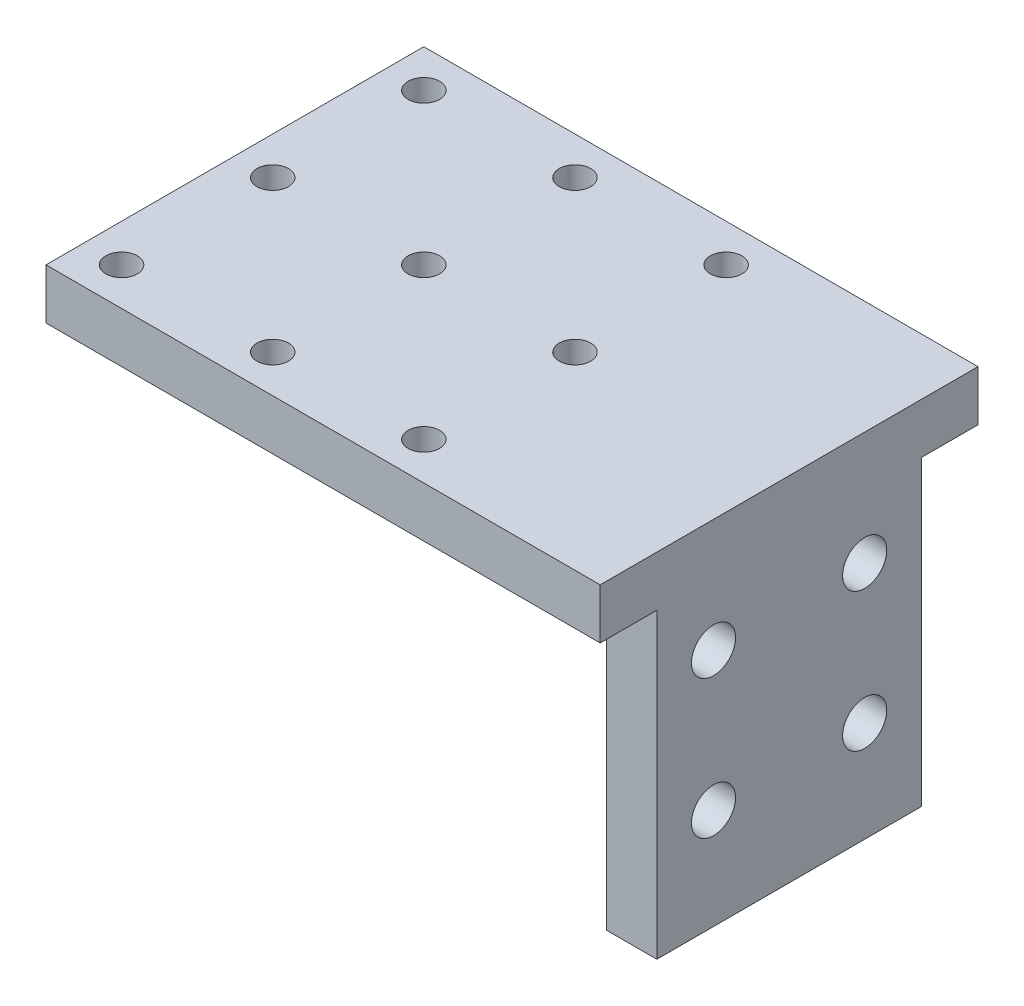
ISO-10303-21;
HEADER;
FILE_DESCRIPTION(('STEP AP214'),'2;1');
FILE_NAME('part.step','',(''),(''),'','','');
FILE_SCHEMA(('AUTOMOTIVE_DESIGN { 1 0 10303 214 1 1 1 1 }'));
ENDSEC;
DATA;
#1=APPLICATION_CONTEXT('core data for automotive mechanical design processes');
#2=APPLICATION_PROTOCOL_DEFINITION('international standard','automotive_design',2000,#1);
#3=PRODUCT_CONTEXT('',#1,'mechanical');
#4=PRODUCT('Part','Part','',(#3));
#5=PRODUCT_RELATED_PRODUCT_CATEGORY('part','',(#4));
#6=PRODUCT_DEFINITION_FORMATION('','',#4);
#7=PRODUCT_DEFINITION_CONTEXT('part definition',#1,'design');
#8=PRODUCT_DEFINITION('design','',#6,#7);
#9=PRODUCT_DEFINITION_SHAPE('','',#8);
#10=(LENGTH_UNIT() NAMED_UNIT(*) SI_UNIT(.MILLI.,.METRE.));
#11=(NAMED_UNIT(*) PLANE_ANGLE_UNIT() SI_UNIT($,.RADIAN.));
#12=(NAMED_UNIT(*) SI_UNIT($,.STERADIAN.) SOLID_ANGLE_UNIT());
#13=UNCERTAINTY_MEASURE_WITH_UNIT(LENGTH_MEASURE(1.E-05),#10,'distance_accuracy_value','');
#14=(GEOMETRIC_REPRESENTATION_CONTEXT(3) GLOBAL_UNCERTAINTY_ASSIGNED_CONTEXT((#13)) GLOBAL_UNIT_ASSIGNED_CONTEXT((#10,
#11,#12)) REPRESENTATION_CONTEXT('',''));
#15=CARTESIAN_POINT('',(0.,0.,0.));
#16=DIRECTION('',(0.,0.,1.));
#17=DIRECTION('',(1.,0.,0.));
#18=AXIS2_PLACEMENT_3D('',#15,#16,#17);
#19=CARTESIAN_POINT('',(0.,0.,-30.));
#20=DIRECTION('',(-1.,0.,0.));
#21=DIRECTION('',(0.,0.,1.));
#22=AXIS2_PLACEMENT_3D('',#19,#20,#21);
#23=PLANE('',#22);
#24=CARTESIAN_POINT('',(0.,19.,-9.));
#25=DIRECTION('',(-1.,0.,0.));
#26=DIRECTION('',(0.,0.,1.));
#27=AXIS2_PLACEMENT_3D('',#24,#25,#26);
#28=CIRCLE('',#27,1.75);
#29=CARTESIAN_POINT('',(0.,19.,-7.25));
#30=VERTEX_POINT('',#29);
#31=EDGE_CURVE('E165',#30,#30,#28,.T.);
#32=ORIENTED_EDGE('',*,*,#31,.F.);
#33=EDGE_LOOP('',(#32));
#34=FACE_BOUND('',#33,.T.);
#35=CARTESIAN_POINT('',(0.,8.,-9.));
#36=DIRECTION('',(-1.,0.,0.));
#37=DIRECTION('',(0.,0.,1.));
#38=AXIS2_PLACEMENT_3D('',#35,#36,#37);
#39=CIRCLE('',#38,1.75);
#40=CARTESIAN_POINT('',(0.,8.,-7.25));
#41=VERTEX_POINT('',#40);
#42=EDGE_CURVE('E40',#41,#41,#39,.T.);
#43=ORIENTED_EDGE('',*,*,#42,.F.);
#44=EDGE_LOOP('',(#43));
#45=FACE_BOUND('',#44,.T.);
#46=DIRECTION('',(0.,0.,1.));
#47=VECTOR('',#46,1.);
#48=CARTESIAN_POINT('',(0.,24.,-30.));
#49=LINE('',#48,#47);
#50=CARTESIAN_POINT('',(0.,24.,-13.));
#51=VERTEX_POINT('',#50);
#52=CARTESIAN_POINT('',(0.,24.,-4.5));
#53=VERTEX_POINT('',#52);
#54=EDGE_CURVE('E143',#51,#53,#49,.T.);
#55=ORIENTED_EDGE('',*,*,#54,.F.);
#56=DIRECTION('',(0.,1.,0.));
#57=VECTOR('',#56,1.);
#58=CARTESIAN_POINT('',(0.,0.,-13.));
#59=LINE('',#58,#57);
#60=CARTESIAN_POINT('',(0.,0.,-13.));
#61=VERTEX_POINT('',#60);
#62=EDGE_CURVE('E53',#61,#51,#59,.T.);
#63=ORIENTED_EDGE('',*,*,#62,.F.);
#64=DIRECTION('',(0.,0.,1.));
#65=VECTOR('',#64,1.);
#66=CARTESIAN_POINT('',(0.,0.,-30.));
#67=LINE('',#66,#65);
#68=CARTESIAN_POINT('',(0.,0.,-4.5));
#69=VERTEX_POINT('',#68);
#70=EDGE_CURVE('E45',#61,#69,#67,.T.);
#71=ORIENTED_EDGE('',*,*,#70,.T.);
#72=DIRECTION('',(0.,-1.,0.));
#73=VECTOR('',#72,1.);
#74=CARTESIAN_POINT('',(0.,0.,-4.5));
#75=LINE('',#74,#73);
#76=EDGE_CURVE('E202',#53,#69,#75,.T.);
#77=ORIENTED_EDGE('',*,*,#76,.F.);
#78=EDGE_LOOP('',(#55,#63,#71,#77));
#79=FACE_BOUND('',#78,.T.);
#80=ADVANCED_FACE('F36',(#34,#45,#79),#23,.T.);
#81=CARTESIAN_POINT('',(4.,28.,-30.));
#82=DIRECTION('',(1.,0.,0.));
#83=DIRECTION('',(0.,1.,0.));
#84=AXIS2_PLACEMENT_3D('',#81,#82,#83);
#85=PLANE('',#84);
#86=CARTESIAN_POINT('',(4.,8.,-9.));
#87=DIRECTION('',(1.,0.,0.));
#88=DIRECTION('',(0.,1.,0.));
#89=AXIS2_PLACEMENT_3D('',#86,#87,#88);
#90=CIRCLE('',#89,1.75);
#91=CARTESIAN_POINT('',(4.,9.75,-9.));
#92=VERTEX_POINT('',#91);
#93=EDGE_CURVE('E185',#92,#92,#90,.T.);
#94=ORIENTED_EDGE('',*,*,#93,.F.);
#95=EDGE_LOOP('',(#94));
#96=FACE_BOUND('',#95,.T.);
#97=CARTESIAN_POINT('',(4.,8.,-21.));
#98=DIRECTION('',(1.,0.,0.));
#99=DIRECTION('',(0.,1.,0.));
#100=AXIS2_PLACEMENT_3D('',#97,#98,#99);
#101=CIRCLE('',#100,1.75);
#102=CARTESIAN_POINT('',(4.,9.75,-21.));
#103=VERTEX_POINT('',#102);
#104=EDGE_CURVE('E175',#103,#103,#101,.T.);
#105=ORIENTED_EDGE('',*,*,#104,.F.);
#106=EDGE_LOOP('',(#105));
#107=FACE_BOUND('',#106,.T.);
#108=CARTESIAN_POINT('',(4.,19.,-21.));
#109=DIRECTION('',(1.,0.,0.));
#110=DIRECTION('',(0.,1.,0.));
#111=AXIS2_PLACEMENT_3D('',#108,#109,#110);
#112=CIRCLE('',#111,1.75);
#113=CARTESIAN_POINT('',(4.,20.75,-21.));
#114=VERTEX_POINT('',#113);
#115=EDGE_CURVE('E172',#114,#114,#112,.T.);
#116=ORIENTED_EDGE('',*,*,#115,.F.);
#117=EDGE_LOOP('',(#116));
#118=FACE_BOUND('',#117,.T.);
#119=CARTESIAN_POINT('',(4.,19.,-9.));
#120=DIRECTION('',(1.,0.,0.));
#121=DIRECTION('',(0.,1.,0.));
#122=AXIS2_PLACEMENT_3D('',#119,#120,#121);
#123=CIRCLE('',#122,1.75);
#124=CARTESIAN_POINT('',(4.,20.75,-9.));
#125=VERTEX_POINT('',#124);
#126=EDGE_CURVE('E169',#125,#125,#123,.T.);
#127=ORIENTED_EDGE('',*,*,#126,.F.);
#128=EDGE_LOOP('',(#127));
#129=FACE_BOUND('',#128,.T.);
#130=DIRECTION('',(0.,1.,0.));
#131=VECTOR('',#130,1.);
#132=CARTESIAN_POINT('',(4.,0.,-25.5));
#133=LINE('',#132,#131);
#134=CARTESIAN_POINT('',(4.,0.,-25.5));
#135=VERTEX_POINT('',#134);
#136=CARTESIAN_POINT('',(4.,24.,-25.5));
#137=VERTEX_POINT('',#136);
#138=EDGE_CURVE('E194',#135,#137,#133,.T.);
#139=ORIENTED_EDGE('',*,*,#138,.T.);
#140=DIRECTION('',(0.,0.,-1.));
#141=VECTOR('',#140,1.);
#142=CARTESIAN_POINT('',(4.,24.,-25.5));
#143=LINE('',#142,#141);
#144=CARTESIAN_POINT('',(4.,24.,-30.));
#145=VERTEX_POINT('',#144);
#146=EDGE_CURVE('E199',#137,#145,#143,.T.);
#147=ORIENTED_EDGE('',*,*,#146,.T.);
#148=DIRECTION('',(0.,1.,0.));
#149=VECTOR('',#148,1.);
#150=CARTESIAN_POINT('',(4.,28.,-30.));
#151=LINE('',#150,#149);
#152=CARTESIAN_POINT('',(4.,28.,-30.));
#153=VERTEX_POINT('',#152);
#154=EDGE_CURVE('E267',#145,#153,#151,.T.);
#155=ORIENTED_EDGE('',*,*,#154,.T.);
#156=DIRECTION('',(0.,0.,1.));
#157=VECTOR('',#156,1.);
#158=CARTESIAN_POINT('',(4.,28.,-30.));
#159=LINE('',#158,#157);
#160=CARTESIAN_POINT('',(4.,28.,0.));
#161=VERTEX_POINT('',#160);
#162=EDGE_CURVE('E159',#153,#161,#159,.T.);
#163=ORIENTED_EDGE('',*,*,#162,.T.);
#164=DIRECTION('',(0.,1.,0.));
#165=VECTOR('',#164,1.);
#166=CARTESIAN_POINT('',(4.,28.,0.));
#167=LINE('',#166,#165);
#168=CARTESIAN_POINT('',(4.,24.,0.));
#169=VERTEX_POINT('',#168);
#170=EDGE_CURVE('E266',#169,#161,#167,.T.);
#171=ORIENTED_EDGE('',*,*,#170,.F.);
#172=DIRECTION('',(0.,0.,1.));
#173=VECTOR('',#172,1.);
#174=CARTESIAN_POINT('',(4.,24.,-4.5));
#175=LINE('',#174,#173);
#176=CARTESIAN_POINT('',(4.,24.,-4.5));
#177=VERTEX_POINT('',#176);
#178=EDGE_CURVE('E210',#177,#169,#175,.T.);
#179=ORIENTED_EDGE('',*,*,#178,.F.);
#180=DIRECTION('',(0.,1.,0.));
#181=VECTOR('',#180,1.);
#182=CARTESIAN_POINT('',(4.,0.,-4.5));
#183=LINE('',#182,#181);
#184=CARTESIAN_POINT('',(4.,0.,-4.5));
#185=VERTEX_POINT('',#184);
#186=EDGE_CURVE('E205',#185,#177,#183,.T.);
#187=ORIENTED_EDGE('',*,*,#186,.F.);
#188=DIRECTION('',(0.,0.,1.));
#189=VECTOR('',#188,1.);
#190=CARTESIAN_POINT('',(4.,0.,-30.));
#191=LINE('',#190,#189);
#192=EDGE_CURVE('E162',#135,#185,#191,.T.);
#193=ORIENTED_EDGE('',*,*,#192,.F.);
#194=EDGE_LOOP('',(#139,#147,#155,#163,#171,#179,#187,#193));
#195=FACE_BOUND('',#194,.T.);
#196=ADVANCED_FACE('F296',(#96,#107,#118,#129,#195),#85,.T.);
#197=CARTESIAN_POINT('',(0.,0.,-30.));
#198=DIRECTION('',(0.,0.,-1.));
#199=DIRECTION('',(-1.,0.,0.));
#200=AXIS2_PLACEMENT_3D('',#197,#198,#199);
#201=PLANE('',#200);
#202=ORIENTED_EDGE('',*,*,#154,.F.);
#203=DIRECTION('',(1.,0.,0.));
#204=VECTOR('',#203,1.);
#205=CARTESIAN_POINT('',(0.,24.,-30.));
#206=LINE('',#205,#204);
#207=CARTESIAN_POINT('',(-40.,24.,-30.));
#208=VERTEX_POINT('',#207);
#209=EDGE_CURVE('E164',#208,#145,#206,.T.);
#210=ORIENTED_EDGE('',*,*,#209,.F.);
#211=DIRECTION('',(0.,-1.,0.));
#212=VECTOR('',#211,1.);
#213=CARTESIAN_POINT('',(-40.,24.,-30.));
#214=LINE('',#213,#212);
#215=CARTESIAN_POINT('',(-40.,28.,-30.));
#216=VERTEX_POINT('',#215);
#217=EDGE_CURVE('E272',#216,#208,#214,.T.);
#218=ORIENTED_EDGE('',*,*,#217,.F.);
#219=DIRECTION('',(-1.,0.,0.));
#220=VECTOR('',#219,1.);
#221=CARTESIAN_POINT('',(-40.,28.,-30.));
#222=LINE('',#221,#220);
#223=EDGE_CURVE('E269',#153,#216,#222,.T.);
#224=ORIENTED_EDGE('',*,*,#223,.F.);
#225=EDGE_LOOP('',(#202,#210,#218,#224));
#226=FACE_BOUND('',#225,.T.);
#227=ADVANCED_FACE('F303',(#226),#201,.T.);
#228=CARTESIAN_POINT('',(4.,0.,-30.));
#229=DIRECTION('',(0.,-1.,0.));
#230=DIRECTION('',(1.,0.,0.));
#231=AXIS2_PLACEMENT_3D('',#228,#229,#230);
#232=PLANE('',#231);
#233=DIRECTION('',(1.,0.,0.));
#234=VECTOR('',#233,1.);
#235=CARTESIAN_POINT('',(0.,0.,-25.5));
#236=LINE('',#235,#234);
#237=CARTESIAN_POINT('',(0.,0.,-25.5));
#238=VERTEX_POINT('',#237);
#239=EDGE_CURVE('E197',#238,#135,#236,.T.);
#240=ORIENTED_EDGE('',*,*,#239,.T.);
#241=ORIENTED_EDGE('',*,*,#192,.T.);
#242=DIRECTION('',(1.,0.,0.));
#243=VECTOR('',#242,1.);
#244=CARTESIAN_POINT('',(0.,0.,-4.5));
#245=LINE('',#244,#243);
#246=EDGE_CURVE('E148',#69,#185,#245,.T.);
#247=ORIENTED_EDGE('',*,*,#246,.F.);
#248=ORIENTED_EDGE('',*,*,#70,.F.);
#249=DIRECTION('',(0.,0.,1.));
#250=VECTOR('',#249,1.);
#251=CARTESIAN_POINT('',(0.,0.,-17.));
#252=LINE('',#251,#250);
#253=CARTESIAN_POINT('',(0.,0.,-17.));
#254=VERTEX_POINT('',#253);
#255=EDGE_CURVE('E124',#254,#61,#252,.T.);
#256=ORIENTED_EDGE('',*,*,#255,.F.);
#257=EDGE_CURVE('E11',#238,#254,#67,.T.);
#258=ORIENTED_EDGE('',*,*,#257,.F.);
#259=EDGE_LOOP('',(#240,#241,#247,#248,#256,#258));
#260=FACE_BOUND('',#259,.T.);
#261=ADVANCED_FACE('F38',(#260),#232,.T.);
#262=DIRECTION('',(0.,1.,0.));
#263=VECTOR('',#262,1.);
#264=CARTESIAN_POINT('',(0.,0.,-17.));
#265=LINE('',#264,#263);
#266=CARTESIAN_POINT('',(0.,24.,-17.));
#267=VERTEX_POINT('',#266);
#268=EDGE_CURVE('E314',#254,#267,#265,.T.);
#269=ORIENTED_EDGE('',*,*,#268,.T.);
#270=CARTESIAN_POINT('',(0.,24.,-25.5));
#271=VERTEX_POINT('',#270);
#272=EDGE_CURVE('E149',#271,#267,#49,.T.);
#273=ORIENTED_EDGE('',*,*,#272,.F.);
#274=DIRECTION('',(0.,-1.,0.));
#275=VECTOR('',#274,1.);
#276=CARTESIAN_POINT('',(0.,0.,-25.5));
#277=LINE('',#276,#275);
#278=EDGE_CURVE('E168',#271,#238,#277,.T.);
#279=ORIENTED_EDGE('',*,*,#278,.T.);
#280=ORIENTED_EDGE('',*,*,#257,.T.);
#281=EDGE_LOOP('',(#269,#273,#279,#280));
#282=FACE_BOUND('',#281,.T.);
#283=CARTESIAN_POINT('',(0.,8.,-21.));
#284=DIRECTION('',(-1.,0.,0.));
#285=DIRECTION('',(0.,0.,1.));
#286=AXIS2_PLACEMENT_3D('',#283,#284,#285);
#287=CIRCLE('',#286,1.75);
#288=CARTESIAN_POINT('',(0.,8.,-19.25));
#289=VERTEX_POINT('',#288);
#290=EDGE_CURVE('E173',#289,#289,#287,.T.);
#291=ORIENTED_EDGE('',*,*,#290,.F.);
#292=EDGE_LOOP('',(#291));
#293=FACE_BOUND('',#292,.T.);
#294=CARTESIAN_POINT('',(0.,19.,-21.));
#295=DIRECTION('',(-1.,0.,0.));
#296=DIRECTION('',(0.,0.,1.));
#297=AXIS2_PLACEMENT_3D('',#294,#295,#296);
#298=CIRCLE('',#297,1.75);
#299=CARTESIAN_POINT('',(0.,19.,-19.25));
#300=VERTEX_POINT('',#299);
#301=EDGE_CURVE('E170',#300,#300,#298,.T.);
#302=ORIENTED_EDGE('',*,*,#301,.F.);
#303=EDGE_LOOP('',(#302));
#304=FACE_BOUND('',#303,.T.);
#305=ADVANCED_FACE('F311',(#282,#293,#304),#23,.T.);
#306=CARTESIAN_POINT('',(0.,24.,-30.));
#307=DIRECTION('',(0.,-1.,0.));
#308=DIRECTION('',(1.,0.,0.));
#309=AXIS2_PLACEMENT_3D('',#306,#307,#308);
#310=PLANE('',#309);
#311=DIRECTION('',(-1.,0.,0.));
#312=VECTOR('',#311,1.);
#313=CARTESIAN_POINT('',(0.,24.,-17.));
#314=LINE('',#313,#312);
#315=CARTESIAN_POINT('',(-8.,24.,-17.));
#316=VERTEX_POINT('',#315);
#317=EDGE_CURVE('E134',#267,#316,#314,.T.);
#318=ORIENTED_EDGE('',*,*,#317,.T.);
#319=DIRECTION('',(0.,0.,1.));
#320=VECTOR('',#319,1.);
#321=CARTESIAN_POINT('',(-8.,24.,-17.));
#322=LINE('',#321,#320);
#323=CARTESIAN_POINT('',(-8.,24.,-13.));
#324=VERTEX_POINT('',#323);
#325=EDGE_CURVE('E133',#316,#324,#322,.T.);
#326=ORIENTED_EDGE('',*,*,#325,.T.);
#327=DIRECTION('',(-1.,0.,0.));
#328=VECTOR('',#327,1.);
#329=CARTESIAN_POINT('',(0.,24.,-13.));
#330=LINE('',#329,#328);
#331=EDGE_CURVE('E137',#51,#324,#330,.T.);
#332=ORIENTED_EDGE('',*,*,#331,.F.);
#333=ORIENTED_EDGE('',*,*,#54,.T.);
#334=DIRECTION('',(-1.,0.,0.));
#335=VECTOR('',#334,1.);
#336=CARTESIAN_POINT('',(0.,24.,-4.5));
#337=LINE('',#336,#335);
#338=EDGE_CURVE('E207',#177,#53,#337,.T.);
#339=ORIENTED_EDGE('',*,*,#338,.F.);
#340=ORIENTED_EDGE('',*,*,#178,.T.);
#341=DIRECTION('',(1.,0.,0.));
#342=VECTOR('',#341,1.);
#343=CARTESIAN_POINT('',(0.,24.,0.));
#344=LINE('',#343,#342);
#345=CARTESIAN_POINT('',(-40.,24.,0.));
#346=VERTEX_POINT('',#345);
#347=EDGE_CURVE('E61',#346,#169,#344,.T.);
#348=ORIENTED_EDGE('',*,*,#347,.F.);
#349=DIRECTION('',(0.,0.,1.));
#350=VECTOR('',#349,1.);
#351=CARTESIAN_POINT('',(-40.,24.,-30.));
#352=LINE('',#351,#350);
#353=EDGE_CURVE('E155',#208,#346,#352,.T.);
#354=ORIENTED_EDGE('',*,*,#353,.F.);
#355=ORIENTED_EDGE('',*,*,#209,.T.);
#356=ORIENTED_EDGE('',*,*,#146,.F.);
#357=DIRECTION('',(-1.,0.,0.));
#358=VECTOR('',#357,1.);
#359=CARTESIAN_POINT('',(0.,24.,-25.5));
#360=LINE('',#359,#358);
#361=EDGE_CURVE('E192',#137,#271,#360,.T.);
#362=ORIENTED_EDGE('',*,*,#361,.T.);
#363=ORIENTED_EDGE('',*,*,#272,.T.);
#364=EDGE_LOOP('',(#318,#326,#332,#333,#339,#340,#348,#354,#355,#356,#362,#363));
#365=FACE_BOUND('',#364,.T.);
#366=CARTESIAN_POINT('',(-25.,24.,-15.));
#367=DIRECTION('',(0.,-1.,0.));
#368=DIRECTION('',(1.,0.,0.));
#369=AXIS2_PLACEMENT_3D('',#366,#367,#368);
#370=CIRCLE('',#369,1.25);
#371=CARTESIAN_POINT('',(-23.75,24.,-15.));
#372=VERTEX_POINT('',#371);
#373=EDGE_CURVE('E215',#372,#372,#370,.T.);
#374=ORIENTED_EDGE('',*,*,#373,.F.);
#375=EDGE_LOOP('',(#374));
#376=FACE_BOUND('',#375,.T.);
#377=CARTESIAN_POINT('',(-25.,24.,-3.));
#378=DIRECTION('',(0.,-1.,0.));
#379=DIRECTION('',(1.,0.,0.));
#380=AXIS2_PLACEMENT_3D('',#377,#378,#379);
#381=CIRCLE('',#380,1.25);
#382=CARTESIAN_POINT('',(-23.75,24.,-3.));
#383=VERTEX_POINT('',#382);
#384=EDGE_CURVE('E221',#383,#383,#381,.T.);
#385=ORIENTED_EDGE('',*,*,#384,.F.);
#386=EDGE_LOOP('',(#385));
#387=FACE_BOUND('',#386,.T.);
#388=CARTESIAN_POINT('',(-13.,24.,-15.));
#389=DIRECTION('',(0.,-1.,0.));
#390=DIRECTION('',(1.,0.,0.));
#391=AXIS2_PLACEMENT_3D('',#388,#389,#390);
#392=CIRCLE('',#391,1.25);
#393=CARTESIAN_POINT('',(-11.75,24.,-15.));
#394=VERTEX_POINT('',#393);
#395=EDGE_CURVE('E227',#394,#394,#392,.T.);
#396=ORIENTED_EDGE('',*,*,#395,.F.);
#397=EDGE_LOOP('',(#396));
#398=FACE_BOUND('',#397,.T.);
#399=CARTESIAN_POINT('',(-13.,24.,-27.));
#400=DIRECTION('',(0.,-1.,0.));
#401=DIRECTION('',(1.,0.,0.));
#402=AXIS2_PLACEMENT_3D('',#399,#400,#401);
#403=CIRCLE('',#402,1.25);
#404=CARTESIAN_POINT('',(-11.75,24.,-27.));
#405=VERTEX_POINT('',#404);
#406=EDGE_CURVE('E233',#405,#405,#403,.T.);
#407=ORIENTED_EDGE('',*,*,#406,.F.);
#408=EDGE_LOOP('',(#407));
#409=FACE_BOUND('',#408,.T.);
#410=CARTESIAN_POINT('',(-25.,24.,-27.));
#411=DIRECTION('',(0.,-1.,0.));
#412=DIRECTION('',(1.,0.,0.));
#413=AXIS2_PLACEMENT_3D('',#410,#411,#412);
#414=CIRCLE('',#413,1.25);
#415=CARTESIAN_POINT('',(-23.75,24.,-27.));
#416=VERTEX_POINT('',#415);
#417=EDGE_CURVE('E239',#416,#416,#414,.T.);
#418=ORIENTED_EDGE('',*,*,#417,.F.);
#419=EDGE_LOOP('',(#418));
#420=FACE_BOUND('',#419,.T.);
#421=CARTESIAN_POINT('',(-37.,24.,-15.));
#422=DIRECTION('',(0.,-1.,0.));
#423=DIRECTION('',(1.,0.,0.));
#424=AXIS2_PLACEMENT_3D('',#421,#422,#423);
#425=CIRCLE('',#424,1.25);
#426=CARTESIAN_POINT('',(-35.75,24.,-15.));
#427=VERTEX_POINT('',#426);
#428=EDGE_CURVE('E245',#427,#427,#425,.T.);
#429=ORIENTED_EDGE('',*,*,#428,.F.);
#430=EDGE_LOOP('',(#429));
#431=FACE_BOUND('',#430,.T.);
#432=CARTESIAN_POINT('',(-37.,24.,-27.));
#433=DIRECTION('',(0.,-1.,0.));
#434=DIRECTION('',(1.,0.,0.));
#435=AXIS2_PLACEMENT_3D('',#432,#433,#434);
#436=CIRCLE('',#435,1.25);
#437=CARTESIAN_POINT('',(-35.75,24.,-27.));
#438=VERTEX_POINT('',#437);
#439=EDGE_CURVE('E251',#438,#438,#436,.T.);
#440=ORIENTED_EDGE('',*,*,#439,.F.);
#441=EDGE_LOOP('',(#440));
#442=FACE_BOUND('',#441,.T.);
#443=CARTESIAN_POINT('',(-13.,24.,-3.));
#444=DIRECTION('',(0.,-1.,0.));
#445=DIRECTION('',(1.,0.,0.));
#446=AXIS2_PLACEMENT_3D('',#443,#444,#445);
#447=CIRCLE('',#446,1.25);
#448=CARTESIAN_POINT('',(-11.75,24.,-3.));
#449=VERTEX_POINT('',#448);
#450=EDGE_CURVE('E257',#449,#449,#447,.T.);
#451=ORIENTED_EDGE('',*,*,#450,.F.);
#452=EDGE_LOOP('',(#451));
#453=FACE_BOUND('',#452,.T.);
#454=CARTESIAN_POINT('',(-37.,24.,-3.));
#455=DIRECTION('',(0.,-1.,0.));
#456=DIRECTION('',(1.,0.,0.));
#457=AXIS2_PLACEMENT_3D('',#454,#455,#456);
#458=CIRCLE('',#457,1.25);
#459=CARTESIAN_POINT('',(-35.75,24.,-3.));
#460=VERTEX_POINT('',#459);
#461=EDGE_CURVE('E263',#460,#460,#458,.T.);
#462=ORIENTED_EDGE('',*,*,#461,.F.);
#463=EDGE_LOOP('',(#462));
#464=FACE_BOUND('',#463,.T.);
#465=ADVANCED_FACE('F289',(#365,#376,#387,#398,#409,#420,#431,#442,#453,#464),#310,.T.);
#466=CARTESIAN_POINT('',(-40.,24.,-30.));
#467=DIRECTION('',(-1.,0.,0.));
#468=DIRECTION('',(0.,0.,1.));
#469=AXIS2_PLACEMENT_3D('',#466,#467,#468);
#470=PLANE('',#469);
#471=DIRECTION('',(0.,-1.,0.));
#472=VECTOR('',#471,1.);
#473=CARTESIAN_POINT('',(-40.,24.,0.));
#474=LINE('',#473,#472);
#475=CARTESIAN_POINT('',(-40.,28.,0.));
#476=VERTEX_POINT('',#475);
#477=EDGE_CURVE('E279',#476,#346,#474,.T.);
#478=ORIENTED_EDGE('',*,*,#477,.F.);
#479=DIRECTION('',(0.,0.,1.));
#480=VECTOR('',#479,1.);
#481=CARTESIAN_POINT('',(-40.,28.,-30.));
#482=LINE('',#481,#480);
#483=EDGE_CURVE('E157',#216,#476,#482,.T.);
#484=ORIENTED_EDGE('',*,*,#483,.F.);
#485=ORIENTED_EDGE('',*,*,#217,.T.);
#486=ORIENTED_EDGE('',*,*,#353,.T.);
#487=EDGE_LOOP('',(#478,#484,#485,#486));
#488=FACE_BOUND('',#487,.T.);
#489=ADVANCED_FACE('F284',(#488),#470,.T.);
#490=CARTESIAN_POINT('',(-40.,28.,-30.));
#491=DIRECTION('',(0.,1.,0.));
#492=DIRECTION('',(0.,0.,1.));
#493=AXIS2_PLACEMENT_3D('',#490,#491,#492);
#494=PLANE('',#493);
#495=CARTESIAN_POINT('',(-25.,28.,-15.));
#496=DIRECTION('',(0.,1.,0.));
#497=DIRECTION('',(0.,0.,1.));
#498=AXIS2_PLACEMENT_3D('',#495,#496,#497);
#499=CIRCLE('',#498,1.25);
#500=CARTESIAN_POINT('',(-25.,28.,-13.75));
#501=VERTEX_POINT('',#500);
#502=EDGE_CURVE('E212',#501,#501,#499,.T.);
#503=ORIENTED_EDGE('',*,*,#502,.F.);
#504=EDGE_LOOP('',(#503));
#505=FACE_BOUND('',#504,.T.);
#506=CARTESIAN_POINT('',(-25.,28.,-3.));
#507=DIRECTION('',(0.,1.,0.));
#508=DIRECTION('',(0.,0.,1.));
#509=AXIS2_PLACEMENT_3D('',#506,#507,#508);
#510=CIRCLE('',#509,1.25);
#511=CARTESIAN_POINT('',(-25.,28.,-1.75));
#512=VERTEX_POINT('',#511);
#513=EDGE_CURVE('E218',#512,#512,#510,.T.);
#514=ORIENTED_EDGE('',*,*,#513,.F.);
#515=EDGE_LOOP('',(#514));
#516=FACE_BOUND('',#515,.T.);
#517=CARTESIAN_POINT('',(-13.,28.,-15.));
#518=DIRECTION('',(0.,1.,0.));
#519=DIRECTION('',(0.,0.,1.));
#520=AXIS2_PLACEMENT_3D('',#517,#518,#519);
#521=CIRCLE('',#520,1.25);
#522=CARTESIAN_POINT('',(-13.,28.,-13.75));
#523=VERTEX_POINT('',#522);
#524=EDGE_CURVE('E224',#523,#523,#521,.T.);
#525=ORIENTED_EDGE('',*,*,#524,.F.);
#526=EDGE_LOOP('',(#525));
#527=FACE_BOUND('',#526,.T.);
#528=CARTESIAN_POINT('',(-13.,28.,-27.));
#529=DIRECTION('',(0.,1.,0.));
#530=DIRECTION('',(0.,0.,1.));
#531=AXIS2_PLACEMENT_3D('',#528,#529,#530);
#532=CIRCLE('',#531,1.25);
#533=CARTESIAN_POINT('',(-13.,28.,-25.75));
#534=VERTEX_POINT('',#533);
#535=EDGE_CURVE('E230',#534,#534,#532,.T.);
#536=ORIENTED_EDGE('',*,*,#535,.F.);
#537=EDGE_LOOP('',(#536));
#538=FACE_BOUND('',#537,.T.);
#539=CARTESIAN_POINT('',(-25.,28.,-27.));
#540=DIRECTION('',(0.,1.,0.));
#541=DIRECTION('',(0.,0.,1.));
#542=AXIS2_PLACEMENT_3D('',#539,#540,#541);
#543=CIRCLE('',#542,1.25);
#544=CARTESIAN_POINT('',(-25.,28.,-25.75));
#545=VERTEX_POINT('',#544);
#546=EDGE_CURVE('E236',#545,#545,#543,.T.);
#547=ORIENTED_EDGE('',*,*,#546,.F.);
#548=EDGE_LOOP('',(#547));
#549=FACE_BOUND('',#548,.T.);
#550=CARTESIAN_POINT('',(-37.,28.,-15.));
#551=DIRECTION('',(0.,1.,0.));
#552=DIRECTION('',(0.,0.,1.));
#553=AXIS2_PLACEMENT_3D('',#550,#551,#552);
#554=CIRCLE('',#553,1.25);
#555=CARTESIAN_POINT('',(-37.,28.,-13.75));
#556=VERTEX_POINT('',#555);
#557=EDGE_CURVE('E242',#556,#556,#554,.T.);
#558=ORIENTED_EDGE('',*,*,#557,.F.);
#559=EDGE_LOOP('',(#558));
#560=FACE_BOUND('',#559,.T.);
#561=CARTESIAN_POINT('',(-37.,28.,-27.));
#562=DIRECTION('',(0.,1.,0.));
#563=DIRECTION('',(0.,0.,1.));
#564=AXIS2_PLACEMENT_3D('',#561,#562,#563);
#565=CIRCLE('',#564,1.25);
#566=CARTESIAN_POINT('',(-37.,28.,-25.75));
#567=VERTEX_POINT('',#566);
#568=EDGE_CURVE('E248',#567,#567,#565,.T.);
#569=ORIENTED_EDGE('',*,*,#568,.F.);
#570=EDGE_LOOP('',(#569));
#571=FACE_BOUND('',#570,.T.);
#572=CARTESIAN_POINT('',(-13.,28.,-3.));
#573=DIRECTION('',(0.,1.,0.));
#574=DIRECTION('',(0.,0.,1.));
#575=AXIS2_PLACEMENT_3D('',#572,#573,#574);
#576=CIRCLE('',#575,1.25);
#577=CARTESIAN_POINT('',(-13.,28.,-1.75));
#578=VERTEX_POINT('',#577);
#579=EDGE_CURVE('E254',#578,#578,#576,.T.);
#580=ORIENTED_EDGE('',*,*,#579,.F.);
#581=EDGE_LOOP('',(#580));
#582=FACE_BOUND('',#581,.T.);
#583=CARTESIAN_POINT('',(-37.,28.,-3.));
#584=DIRECTION('',(0.,1.,0.));
#585=DIRECTION('',(0.,0.,1.));
#586=AXIS2_PLACEMENT_3D('',#583,#584,#585);
#587=CIRCLE('',#586,1.25);
#588=CARTESIAN_POINT('',(-37.,28.,-1.75));
#589=VERTEX_POINT('',#588);
#590=EDGE_CURVE('E260',#589,#589,#587,.T.);
#591=ORIENTED_EDGE('',*,*,#590,.F.);
#592=EDGE_LOOP('',(#591));
#593=FACE_BOUND('',#592,.T.);
#594=DIRECTION('',(-1.,0.,0.));
#595=VECTOR('',#594,1.);
#596=CARTESIAN_POINT('',(-40.,28.,0.));
#597=LINE('',#596,#595);
#598=EDGE_CURVE('E277',#161,#476,#597,.T.);
#599=ORIENTED_EDGE('',*,*,#598,.F.);
#600=ORIENTED_EDGE('',*,*,#162,.F.);
#601=ORIENTED_EDGE('',*,*,#223,.T.);
#602=ORIENTED_EDGE('',*,*,#483,.T.);
#603=EDGE_LOOP('',(#599,#600,#601,#602));
#604=FACE_BOUND('',#603,.T.);
#605=ADVANCED_FACE('F301',(#505,#516,#527,#538,#549,#560,#571,#582,#593,#604),#494,.T.);
#606=CARTESIAN_POINT('',(0.,0.,0.));
#607=DIRECTION('',(0.,0.,-1.));
#608=DIRECTION('',(-1.,0.,0.));
#609=AXIS2_PLACEMENT_3D('',#606,#607,#608);
#610=PLANE('',#609);
#611=ORIENTED_EDGE('',*,*,#347,.T.);
#612=ORIENTED_EDGE('',*,*,#170,.T.);
#613=ORIENTED_EDGE('',*,*,#598,.T.);
#614=ORIENTED_EDGE('',*,*,#477,.T.);
#615=EDGE_LOOP('',(#611,#612,#613,#614));
#616=FACE_BOUND('',#615,.T.);
#617=ADVANCED_FACE('F281',(#616),#610,.F.);
#618=CARTESIAN_POINT('',(-37.,0.,-3.));
#619=DIRECTION('',(0.,1.,0.));
#620=DIRECTION('',(0.,0.,1.));
#621=AXIS2_PLACEMENT_3D('',#618,#619,#620);
#622=CYLINDRICAL_SURFACE('',#621,1.25);
#623=ORIENTED_EDGE('',*,*,#461,.T.);
#624=EDGE_LOOP('',(#623));
#625=FACE_BOUND('',#624,.T.);
#626=ORIENTED_EDGE('',*,*,#590,.T.);
#627=EDGE_LOOP('',(#626));
#628=FACE_BOUND('',#627,.T.);
#629=ADVANCED_FACE('F367',(#625,#628),#622,.F.);
#630=CARTESIAN_POINT('',(-13.,0.,-3.));
#631=DIRECTION('',(0.,1.,0.));
#632=DIRECTION('',(0.,0.,1.));
#633=AXIS2_PLACEMENT_3D('',#630,#631,#632);
#634=CYLINDRICAL_SURFACE('',#633,1.25);
#635=ORIENTED_EDGE('',*,*,#450,.T.);
#636=EDGE_LOOP('',(#635));
#637=FACE_BOUND('',#636,.T.);
#638=ORIENTED_EDGE('',*,*,#579,.T.);
#639=EDGE_LOOP('',(#638));
#640=FACE_BOUND('',#639,.T.);
#641=ADVANCED_FACE('F374',(#637,#640),#634,.F.);
#642=CARTESIAN_POINT('',(-37.,0.,-27.));
#643=DIRECTION('',(0.,1.,0.));
#644=DIRECTION('',(0.,0.,1.));
#645=AXIS2_PLACEMENT_3D('',#642,#643,#644);
#646=CYLINDRICAL_SURFACE('',#645,1.25);
#647=ORIENTED_EDGE('',*,*,#439,.T.);
#648=EDGE_LOOP('',(#647));
#649=FACE_BOUND('',#648,.T.);
#650=ORIENTED_EDGE('',*,*,#568,.T.);
#651=EDGE_LOOP('',(#650));
#652=FACE_BOUND('',#651,.T.);
#653=ADVANCED_FACE('F402',(#649,#652),#646,.F.);
#654=CARTESIAN_POINT('',(-37.,0.,-15.));
#655=DIRECTION('',(0.,1.,0.));
#656=DIRECTION('',(0.,0.,1.));
#657=AXIS2_PLACEMENT_3D('',#654,#655,#656);
#658=CYLINDRICAL_SURFACE('',#657,1.25);
#659=ORIENTED_EDGE('',*,*,#428,.T.);
#660=EDGE_LOOP('',(#659));
#661=FACE_BOUND('',#660,.T.);
#662=ORIENTED_EDGE('',*,*,#557,.T.);
#663=EDGE_LOOP('',(#662));
#664=FACE_BOUND('',#663,.T.);
#665=ADVANCED_FACE('F407',(#661,#664),#658,.F.);
#666=CARTESIAN_POINT('',(-25.,0.,-27.));
#667=DIRECTION('',(0.,1.,0.));
#668=DIRECTION('',(0.,0.,1.));
#669=AXIS2_PLACEMENT_3D('',#666,#667,#668);
#670=CYLINDRICAL_SURFACE('',#669,1.25);
#671=ORIENTED_EDGE('',*,*,#417,.T.);
#672=EDGE_LOOP('',(#671));
#673=FACE_BOUND('',#672,.T.);
#674=ORIENTED_EDGE('',*,*,#546,.T.);
#675=EDGE_LOOP('',(#674));
#676=FACE_BOUND('',#675,.T.);
#677=ADVANCED_FACE('F413',(#673,#676),#670,.F.);
#678=CARTESIAN_POINT('',(-13.,0.,-27.));
#679=DIRECTION('',(0.,1.,0.));
#680=DIRECTION('',(0.,0.,1.));
#681=AXIS2_PLACEMENT_3D('',#678,#679,#680);
#682=CYLINDRICAL_SURFACE('',#681,1.25);
#683=ORIENTED_EDGE('',*,*,#406,.T.);
#684=EDGE_LOOP('',(#683));
#685=FACE_BOUND('',#684,.T.);
#686=ORIENTED_EDGE('',*,*,#535,.T.);
#687=EDGE_LOOP('',(#686));
#688=FACE_BOUND('',#687,.T.);
#689=ADVANCED_FACE('F417',(#685,#688),#682,.F.);
#690=CARTESIAN_POINT('',(-13.,0.,-15.));
#691=DIRECTION('',(0.,1.,0.));
#692=DIRECTION('',(0.,0.,1.));
#693=AXIS2_PLACEMENT_3D('',#690,#691,#692);
#694=CYLINDRICAL_SURFACE('',#693,1.25);
#695=ORIENTED_EDGE('',*,*,#395,.T.);
#696=EDGE_LOOP('',(#695));
#697=FACE_BOUND('',#696,.T.);
#698=ORIENTED_EDGE('',*,*,#524,.T.);
#699=EDGE_LOOP('',(#698));
#700=FACE_BOUND('',#699,.T.);
#701=ADVANCED_FACE('F421',(#697,#700),#694,.F.);
#702=CARTESIAN_POINT('',(-25.,0.,-3.));
#703=DIRECTION('',(0.,1.,0.));
#704=DIRECTION('',(0.,0.,1.));
#705=AXIS2_PLACEMENT_3D('',#702,#703,#704);
#706=CYLINDRICAL_SURFACE('',#705,1.25);
#707=ORIENTED_EDGE('',*,*,#384,.T.);
#708=EDGE_LOOP('',(#707));
#709=FACE_BOUND('',#708,.T.);
#710=ORIENTED_EDGE('',*,*,#513,.T.);
#711=EDGE_LOOP('',(#710));
#712=FACE_BOUND('',#711,.T.);
#713=ADVANCED_FACE('F425',(#709,#712),#706,.F.);
#714=CARTESIAN_POINT('',(-25.,0.,-15.));
#715=DIRECTION('',(0.,1.,0.));
#716=DIRECTION('',(0.,0.,1.));
#717=AXIS2_PLACEMENT_3D('',#714,#715,#716);
#718=CYLINDRICAL_SURFACE('',#717,1.25);
#719=ORIENTED_EDGE('',*,*,#373,.T.);
#720=EDGE_LOOP('',(#719));
#721=FACE_BOUND('',#720,.T.);
#722=ORIENTED_EDGE('',*,*,#502,.T.);
#723=EDGE_LOOP('',(#722));
#724=FACE_BOUND('',#723,.T.);
#725=ADVANCED_FACE('F429',(#721,#724),#718,.F.);
#726=CARTESIAN_POINT('',(0.,0.,-4.5));
#727=DIRECTION('',(0.,0.,-1.));
#728=DIRECTION('',(-1.,0.,0.));
#729=AXIS2_PLACEMENT_3D('',#726,#727,#728);
#730=PLANE('',#729);
#731=ORIENTED_EDGE('',*,*,#76,.T.);
#732=ORIENTED_EDGE('',*,*,#246,.T.);
#733=ORIENTED_EDGE('',*,*,#186,.T.);
#734=ORIENTED_EDGE('',*,*,#338,.T.);
#735=EDGE_LOOP('',(#731,#732,#733,#734));
#736=FACE_BOUND('',#735,.T.);
#737=ADVANCED_FACE('F344',(#736),#730,.F.);
#738=CARTESIAN_POINT('',(0.,0.,-25.5));
#739=DIRECTION('',(0.,0.,1.));
#740=DIRECTION('',(-1.,0.,0.));
#741=AXIS2_PLACEMENT_3D('',#738,#739,#740);
#742=PLANE('',#741);
#743=ORIENTED_EDGE('',*,*,#278,.F.);
#744=ORIENTED_EDGE('',*,*,#361,.F.);
#745=ORIENTED_EDGE('',*,*,#138,.F.);
#746=ORIENTED_EDGE('',*,*,#239,.F.);
#747=EDGE_LOOP('',(#743,#744,#745,#746));
#748=FACE_BOUND('',#747,.T.);
#749=ADVANCED_FACE('F308',(#748),#742,.F.);
#750=CARTESIAN_POINT('',(-40.,19.,-9.));
#751=DIRECTION('',(1.,0.,0.));
#752=DIRECTION('',(0.,1.,0.));
#753=AXIS2_PLACEMENT_3D('',#750,#751,#752);
#754=CYLINDRICAL_SURFACE('',#753,1.75);
#755=ORIENTED_EDGE('',*,*,#31,.T.);
#756=EDGE_LOOP('',(#755));
#757=FACE_BOUND('',#756,.T.);
#758=ORIENTED_EDGE('',*,*,#126,.T.);
#759=EDGE_LOOP('',(#758));
#760=FACE_BOUND('',#759,.T.);
#761=ADVANCED_FACE('F332',(#757,#760),#754,.F.);
#762=CARTESIAN_POINT('',(-40.,19.,-21.));
#763=DIRECTION('',(1.,0.,0.));
#764=DIRECTION('',(0.,1.,0.));
#765=AXIS2_PLACEMENT_3D('',#762,#763,#764);
#766=CYLINDRICAL_SURFACE('',#765,1.75);
#767=ORIENTED_EDGE('',*,*,#301,.T.);
#768=EDGE_LOOP('',(#767));
#769=FACE_BOUND('',#768,.T.);
#770=ORIENTED_EDGE('',*,*,#115,.T.);
#771=EDGE_LOOP('',(#770));
#772=FACE_BOUND('',#771,.T.);
#773=ADVANCED_FACE('F334',(#769,#772),#766,.F.);
#774=CARTESIAN_POINT('',(-40.,8.,-21.));
#775=DIRECTION('',(1.,0.,0.));
#776=DIRECTION('',(0.,1.,0.));
#777=AXIS2_PLACEMENT_3D('',#774,#775,#776);
#778=CYLINDRICAL_SURFACE('',#777,1.75);
#779=ORIENTED_EDGE('',*,*,#290,.T.);
#780=EDGE_LOOP('',(#779));
#781=FACE_BOUND('',#780,.T.);
#782=ORIENTED_EDGE('',*,*,#104,.T.);
#783=EDGE_LOOP('',(#782));
#784=FACE_BOUND('',#783,.T.);
#785=ADVANCED_FACE('F341',(#781,#784),#778,.F.);
#786=CARTESIAN_POINT('',(-40.,7.99999999999999,-9.));
#787=DIRECTION('',(1.,0.,0.));
#788=DIRECTION('',(0.,1.,0.));
#789=AXIS2_PLACEMENT_3D('',#786,#787,#788);
#790=CYLINDRICAL_SURFACE('',#789,1.75);
#791=ORIENTED_EDGE('',*,*,#42,.T.);
#792=EDGE_LOOP('',(#791));
#793=FACE_BOUND('',#792,.T.);
#794=ORIENTED_EDGE('',*,*,#93,.T.);
#795=EDGE_LOOP('',(#794));
#796=FACE_BOUND('',#795,.T.);
#797=ADVANCED_FACE('F323',(#793,#796),#790,.F.);
#798=CARTESIAN_POINT('',(-8.,24.,-17.));
#799=DIRECTION('',(-0.948683298050514,-0.316227766016838,0.));
#800=DIRECTION('',(0.316227766016838,-0.948683298050514,0.));
#801=AXIS2_PLACEMENT_3D('',#798,#799,#800);
#802=PLANE('',#801);
#803=ORIENTED_EDGE('',*,*,#255,.T.);
#804=DIRECTION('',(0.316227766016838,-0.948683298050514,0.));
#805=VECTOR('',#804,1.);
#806=CARTESIAN_POINT('',(-8.,24.,-13.));
#807=LINE('',#806,#805);
#808=EDGE_CURVE('E126',#324,#61,#807,.T.);
#809=ORIENTED_EDGE('',*,*,#808,.F.);
#810=ORIENTED_EDGE('',*,*,#325,.F.);
#811=DIRECTION('',(0.316227766016838,-0.948683298050514,0.));
#812=VECTOR('',#811,1.);
#813=CARTESIAN_POINT('',(-8.,24.,-17.));
#814=LINE('',#813,#812);
#815=EDGE_CURVE('E129',#316,#254,#814,.T.);
#816=ORIENTED_EDGE('',*,*,#815,.T.);
#817=EDGE_LOOP('',(#803,#809,#810,#816));
#818=FACE_BOUND('',#817,.T.);
#819=ADVANCED_FACE('F125',(#818),#802,.T.);
#820=CARTESIAN_POINT('',(0.,0.,-17.));
#821=DIRECTION('',(0.,0.,-1.));
#822=DIRECTION('',(-1.,0.,0.));
#823=AXIS2_PLACEMENT_3D('',#820,#821,#822);
#824=PLANE('',#823);
#825=ORIENTED_EDGE('',*,*,#815,.F.);
#826=ORIENTED_EDGE('',*,*,#317,.F.);
#827=ORIENTED_EDGE('',*,*,#268,.F.);
#828=EDGE_LOOP('',(#825,#826,#827));
#829=FACE_BOUND('',#828,.T.);
#830=ADVANCED_FACE('F508',(#829),#824,.T.);
#831=CARTESIAN_POINT('',(0.,0.,-13.));
#832=DIRECTION('',(0.,0.,-1.));
#833=DIRECTION('',(-1.,0.,0.));
#834=AXIS2_PLACEMENT_3D('',#831,#832,#833);
#835=PLANE('',#834);
#836=ORIENTED_EDGE('',*,*,#808,.T.);
#837=ORIENTED_EDGE('',*,*,#62,.T.);
#838=ORIENTED_EDGE('',*,*,#331,.T.);
#839=EDGE_LOOP('',(#836,#837,#838));
#840=FACE_BOUND('',#839,.T.);
#841=ADVANCED_FACE('F136',(#840),#835,.F.);
#842=CLOSED_SHELL('',(#80,#196,#227,#261,#305,#465,#489,#605,#617,#629,#641,#653,#665,#677,#689,
#701,#713,#725,#737,#749,#761,#773,#785,#797,#819,#830,#841));
#843=MANIFOLD_SOLID_BREP('B2',#842);
#844=ADVANCED_BREP_SHAPE_REPRESENTATION('',(#18,#843),#14);
#845=SHAPE_DEFINITION_REPRESENTATION(#9,#844);
ENDSEC;
END-ISO-10303-21;
